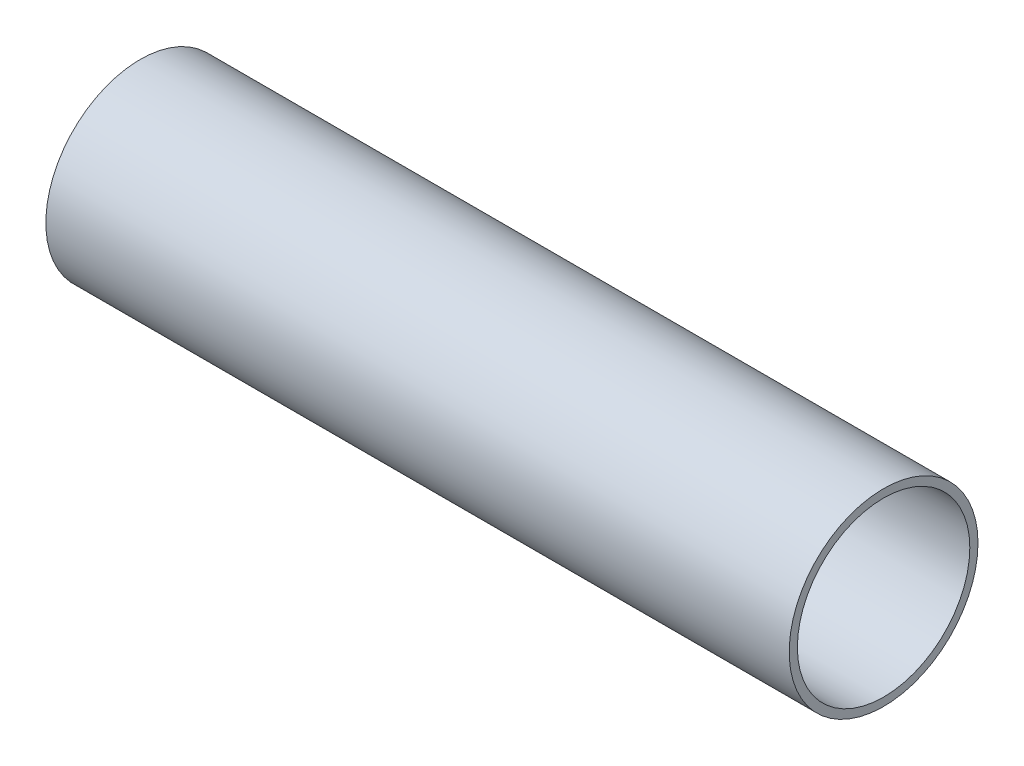
ISO-10303-21;
HEADER;
FILE_DESCRIPTION(('STEP AP214'),'2;1');
FILE_NAME('part.step','',(''),(''),'','','');
FILE_SCHEMA(('AUTOMOTIVE_DESIGN { 1 0 10303 214 1 1 1 1 }'));
ENDSEC;
DATA;
#1=APPLICATION_CONTEXT('core data for automotive mechanical design processes');
#2=APPLICATION_PROTOCOL_DEFINITION('international standard','automotive_design',2000,#1);
#3=PRODUCT_CONTEXT('',#1,'mechanical');
#4=PRODUCT('Part','Part','',(#3));
#5=PRODUCT_RELATED_PRODUCT_CATEGORY('part','',(#4));
#6=PRODUCT_DEFINITION_FORMATION('','',#4);
#7=PRODUCT_DEFINITION_CONTEXT('part definition',#1,'design');
#8=PRODUCT_DEFINITION('design','',#6,#7);
#9=PRODUCT_DEFINITION_SHAPE('','',#8);
#10=(LENGTH_UNIT() NAMED_UNIT(*) SI_UNIT(.MILLI.,.METRE.));
#11=(NAMED_UNIT(*) PLANE_ANGLE_UNIT() SI_UNIT($,.RADIAN.));
#12=(NAMED_UNIT(*) SI_UNIT($,.STERADIAN.) SOLID_ANGLE_UNIT());
#13=UNCERTAINTY_MEASURE_WITH_UNIT(LENGTH_MEASURE(1.E-05),#10,'distance_accuracy_value','');
#14=(GEOMETRIC_REPRESENTATION_CONTEXT(3) GLOBAL_UNCERTAINTY_ASSIGNED_CONTEXT((#13)) GLOBAL_UNIT_ASSIGNED_CONTEXT((#10,
#11,#12)) REPRESENTATION_CONTEXT('',''));
#15=CARTESIAN_POINT('',(0.,0.,0.));
#16=DIRECTION('',(0.,0.,1.));
#17=DIRECTION('',(1.,0.,0.));
#18=AXIS2_PLACEMENT_3D('',#15,#16,#17);
#19=CARTESIAN_POINT('',(75.,0.,0.));
#20=DIRECTION('',(-1.,0.,0.));
#21=DIRECTION('',(0.,0.,1.));
#22=AXIS2_PLACEMENT_3D('',#19,#20,#21);
#23=CYLINDRICAL_SURFACE('',#22,19.05);
#24=CARTESIAN_POINT('',(75.,0.,0.));
#25=DIRECTION('',(1.,0.,0.));
#26=DIRECTION('',(0.,0.,-1.));
#27=AXIS2_PLACEMENT_3D('',#24,#25,#26);
#28=CIRCLE('',#27,19.05);
#29=CARTESIAN_POINT('',(75.,0.,-19.05));
#30=VERTEX_POINT('',#29);
#31=EDGE_CURVE('E10',#30,#30,#28,.T.);
#32=ORIENTED_EDGE('',*,*,#31,.F.);
#33=EDGE_LOOP('',(#32));
#34=FACE_BOUND('',#33,.T.);
#35=CARTESIAN_POINT('',(-75.,0.,0.));
#36=DIRECTION('',(1.,0.,0.));
#37=DIRECTION('',(0.,0.,-1.));
#38=AXIS2_PLACEMENT_3D('',#35,#36,#37);
#39=CIRCLE('',#38,19.05);
#40=CARTESIAN_POINT('',(-75.,0.,-19.05));
#41=VERTEX_POINT('',#40);
#42=EDGE_CURVE('E42',#41,#41,#39,.T.);
#43=ORIENTED_EDGE('',*,*,#42,.T.);
#44=EDGE_LOOP('',(#43));
#45=FACE_BOUND('',#44,.T.);
#46=ADVANCED_FACE('F39',(#34,#45),#23,.T.);
#47=CARTESIAN_POINT('',(75.,0.,0.));
#48=DIRECTION('',(1.,0.,0.));
#49=DIRECTION('',(0.,0.,-1.));
#50=AXIS2_PLACEMENT_3D('',#47,#48,#49);
#51=PLANE('',#50);
#52=CARTESIAN_POINT('',(75.,0.,0.));
#53=DIRECTION('',(1.,0.,0.));
#54=DIRECTION('',(0.,0.,-1.));
#55=AXIS2_PLACEMENT_3D('',#52,#53,#54);
#56=CIRCLE('',#55,17.4);
#57=CARTESIAN_POINT('',(75.,0.,-17.4));
#58=VERTEX_POINT('',#57);
#59=EDGE_CURVE('E51',#58,#58,#56,.T.);
#60=ORIENTED_EDGE('',*,*,#59,.F.);
#61=EDGE_LOOP('',(#60));
#62=FACE_BOUND('',#61,.T.);
#63=ORIENTED_EDGE('',*,*,#31,.T.);
#64=EDGE_LOOP('',(#63));
#65=FACE_BOUND('',#64,.T.);
#66=ADVANCED_FACE('F66',(#62,#65),#51,.T.);
#67=CARTESIAN_POINT('',(-75.,0.,0.));
#68=DIRECTION('',(1.,0.,0.));
#69=DIRECTION('',(0.,0.,-1.));
#70=AXIS2_PLACEMENT_3D('',#67,#68,#69);
#71=PLANE('',#70);
#72=CARTESIAN_POINT('',(-75.,0.,0.));
#73=DIRECTION('',(-1.,0.,0.));
#74=DIRECTION('',(0.,0.,1.));
#75=AXIS2_PLACEMENT_3D('',#72,#73,#74);
#76=CIRCLE('',#75,17.4);
#77=CARTESIAN_POINT('',(-75.,0.,17.4));
#78=VERTEX_POINT('',#77);
#79=EDGE_CURVE('E56',#78,#78,#76,.T.);
#80=ORIENTED_EDGE('',*,*,#79,.F.);
#81=EDGE_LOOP('',(#80));
#82=FACE_BOUND('',#81,.T.);
#83=ORIENTED_EDGE('',*,*,#42,.F.);
#84=EDGE_LOOP('',(#83));
#85=FACE_BOUND('',#84,.T.);
#86=ADVANCED_FACE('F63',(#82,#85),#71,.F.);
#87=CARTESIAN_POINT('',(122.,0.,0.));
#88=DIRECTION('',(-1.,0.,0.));
#89=DIRECTION('',(0.,0.,1.));
#90=AXIS2_PLACEMENT_3D('',#87,#88,#89);
#91=CYLINDRICAL_SURFACE('',#90,17.4);
#92=ORIENTED_EDGE('',*,*,#59,.T.);
#93=EDGE_LOOP('',(#92));
#94=FACE_BOUND('',#93,.T.);
#95=ORIENTED_EDGE('',*,*,#79,.T.);
#96=EDGE_LOOP('',(#95));
#97=FACE_BOUND('',#96,.T.);
#98=ADVANCED_FACE('F61',(#94,#97),#91,.F.);
#99=CLOSED_SHELL('',(#46,#66,#86,#98));
#100=MANIFOLD_SOLID_BREP('B2',#99);
#101=ADVANCED_BREP_SHAPE_REPRESENTATION('',(#18,#100),#14);
#102=SHAPE_DEFINITION_REPRESENTATION(#9,#101);
ENDSEC;
END-ISO-10303-21;
